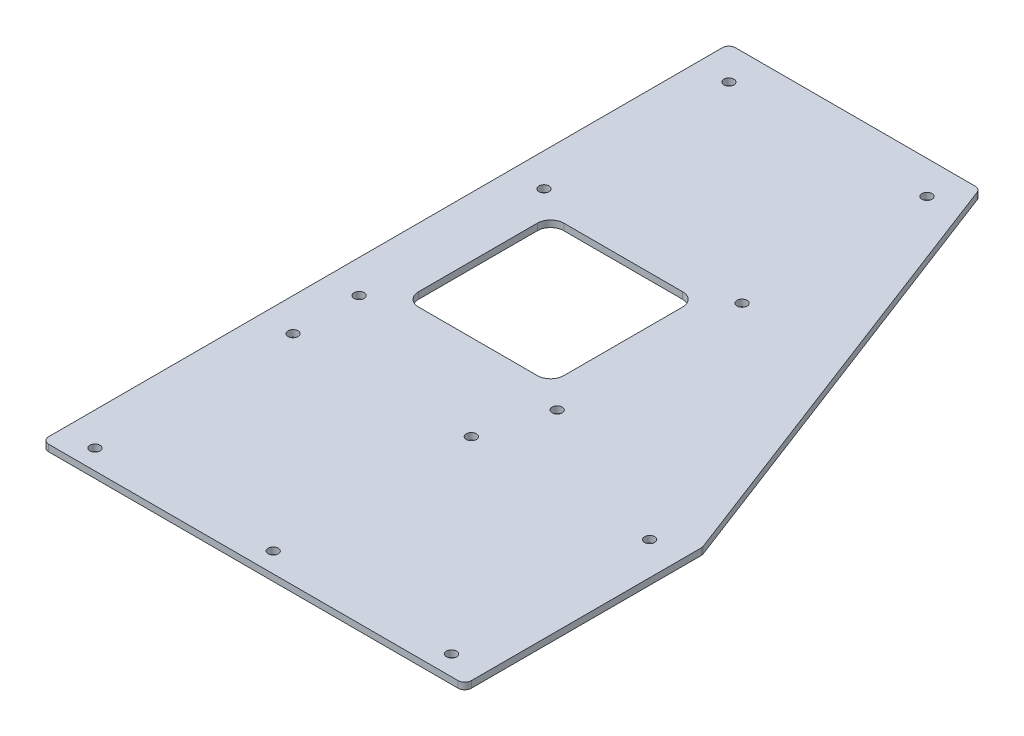
ISO-10303-21;
HEADER;
FILE_DESCRIPTION(('STEP AP214'),'2;1');
FILE_NAME('part.step','',(''),(''),'','','');
FILE_SCHEMA(('AUTOMOTIVE_DESIGN { 1 0 10303 214 1 1 1 1 }'));
ENDSEC;
DATA;
#1=APPLICATION_CONTEXT('core data for automotive mechanical design processes');
#2=APPLICATION_PROTOCOL_DEFINITION('international standard','automotive_design',2000,#1);
#3=PRODUCT_CONTEXT('',#1,'mechanical');
#4=PRODUCT('Part','Part','',(#3));
#5=PRODUCT_RELATED_PRODUCT_CATEGORY('part','',(#4));
#6=PRODUCT_DEFINITION_FORMATION('','',#4);
#7=PRODUCT_DEFINITION_CONTEXT('part definition',#1,'design');
#8=PRODUCT_DEFINITION('design','',#6,#7);
#9=PRODUCT_DEFINITION_SHAPE('','',#8);
#10=(LENGTH_UNIT() NAMED_UNIT(*) SI_UNIT(.MILLI.,.METRE.));
#11=(NAMED_UNIT(*) PLANE_ANGLE_UNIT() SI_UNIT($,.RADIAN.));
#12=(NAMED_UNIT(*) SI_UNIT($,.STERADIAN.) SOLID_ANGLE_UNIT());
#13=UNCERTAINTY_MEASURE_WITH_UNIT(LENGTH_MEASURE(1.E-05),#10,'distance_accuracy_value','');
#14=(GEOMETRIC_REPRESENTATION_CONTEXT(3) GLOBAL_UNCERTAINTY_ASSIGNED_CONTEXT((#13)) GLOBAL_UNIT_ASSIGNED_CONTEXT((#10,
#11,#12)) REPRESENTATION_CONTEXT('',''));
#15=CARTESIAN_POINT('',(0.,0.,0.));
#16=DIRECTION('',(0.,0.,1.));
#17=DIRECTION('',(1.,0.,0.));
#18=AXIS2_PLACEMENT_3D('',#15,#16,#17);
#19=CARTESIAN_POINT('',(0.,3.175,0.));
#20=DIRECTION('',(0.,-1.,0.));
#21=DIRECTION('',(0.,0.,-1.));
#22=AXIS2_PLACEMENT_3D('',#19,#20,#21);
#23=PLANE('',#22);
#24=DIRECTION('',(-1.,0.,0.));
#25=VECTOR('',#24,1.);
#26=CARTESIAN_POINT('',(28.5750000000001,3.175,-215.9));
#27=LINE('',#26,#25);
#28=CARTESIAN_POINT('',(92.0750000000001,3.175,-215.9));
#29=VERTEX_POINT('',#28);
#30=CARTESIAN_POINT('',(34.9250000000001,3.175,-215.9));
#31=VERTEX_POINT('',#30);
#32=EDGE_CURVE('E321',#29,#31,#27,.T.);
#33=ORIENTED_EDGE('',*,*,#32,.F.);
#34=CARTESIAN_POINT('',(92.0750000000001,3.175,-209.55));
#35=DIRECTION('',(0.,-1.,0.));
#36=DIRECTION('',(0.,0.,-1.));
#37=AXIS2_PLACEMENT_3D('',#34,#35,#36);
#38=CIRCLE('',#37,6.35);
#39=CARTESIAN_POINT('',(98.4250000000001,3.175,-209.55));
#40=VERTEX_POINT('',#39);
#41=EDGE_CURVE('E311',#29,#40,#38,.T.);
#42=ORIENTED_EDGE('',*,*,#41,.T.);
#43=DIRECTION('',(0.,0.,-1.));
#44=VECTOR('',#43,1.);
#45=CARTESIAN_POINT('',(98.4250000000001,3.175,-215.9));
#46=LINE('',#45,#44);
#47=CARTESIAN_POINT('',(98.4250000000001,3.175,-152.4));
#48=VERTEX_POINT('',#47);
#49=EDGE_CURVE('E329',#48,#40,#46,.T.);
#50=ORIENTED_EDGE('',*,*,#49,.F.);
#51=CARTESIAN_POINT('',(92.0750000000001,3.175,-152.4));
#52=DIRECTION('',(0.,-1.,0.));
#53=DIRECTION('',(0.,0.,-1.));
#54=AXIS2_PLACEMENT_3D('',#51,#52,#53);
#55=CIRCLE('',#54,6.35);
#56=CARTESIAN_POINT('',(92.0750000000001,3.175,-146.05));
#57=VERTEX_POINT('',#56);
#58=EDGE_CURVE('E299',#48,#57,#55,.T.);
#59=ORIENTED_EDGE('',*,*,#58,.T.);
#60=DIRECTION('',(1.,0.,0.));
#61=VECTOR('',#60,1.);
#62=CARTESIAN_POINT('',(28.5750000000001,3.175,-146.05));
#63=LINE('',#62,#61);
#64=CARTESIAN_POINT('',(34.9250000000001,3.175,-146.05));
#65=VERTEX_POINT('',#64);
#66=EDGE_CURVE('E359',#65,#57,#63,.T.);
#67=ORIENTED_EDGE('',*,*,#66,.F.);
#68=CARTESIAN_POINT('',(34.9250000000001,3.175,-152.4));
#69=DIRECTION('',(0.,-1.,0.));
#70=DIRECTION('',(0.,0.,-1.));
#71=AXIS2_PLACEMENT_3D('',#68,#69,#70);
#72=CIRCLE('',#71,6.35);
#73=CARTESIAN_POINT('',(28.5750000000001,3.175,-152.4));
#74=VERTEX_POINT('',#73);
#75=EDGE_CURVE('E305',#65,#74,#72,.T.);
#76=ORIENTED_EDGE('',*,*,#75,.T.);
#77=DIRECTION('',(0.,0.,1.));
#78=VECTOR('',#77,1.);
#79=CARTESIAN_POINT('',(28.5750000000001,3.175,-215.9));
#80=LINE('',#79,#78);
#81=CARTESIAN_POINT('',(28.5750000000001,3.175,-209.55));
#82=VERTEX_POINT('',#81);
#83=EDGE_CURVE('E323',#82,#74,#80,.T.);
#84=ORIENTED_EDGE('',*,*,#83,.F.);
#85=CARTESIAN_POINT('',(34.9250000000001,3.175,-209.55));
#86=DIRECTION('',(0.,-1.,0.));
#87=DIRECTION('',(0.,0.,-1.));
#88=AXIS2_PLACEMENT_3D('',#85,#86,#87);
#89=CIRCLE('',#88,6.35);
#90=EDGE_CURVE('E45',#82,#31,#89,.T.);
#91=ORIENTED_EDGE('',*,*,#90,.T.);
#92=EDGE_LOOP('',(#33,#42,#50,#59,#67,#76,#84,#91));
#93=FACE_BOUND('',#92,.T.);
#94=DIRECTION('',(-1.,0.,0.));
#95=VECTOR('',#94,1.);
#96=CARTESIAN_POINT('',(0.,3.175,-330.2));
#97=LINE('',#96,#95);
#98=CARTESIAN_POINT('',(118.464801632579,3.175,-330.2));
#99=VERTEX_POINT('',#98);
#100=CARTESIAN_POINT('',(3.175,3.175,-330.2));
#101=VERTEX_POINT('',#100);
#102=EDGE_CURVE('E207',#99,#101,#97,.T.);
#103=ORIENTED_EDGE('',*,*,#102,.T.);
#104=CARTESIAN_POINT('',(3.175,3.175,-327.025));
#105=DIRECTION('',(0.,-1.,0.));
#106=DIRECTION('',(0.,0.,-1.));
#107=AXIS2_PLACEMENT_3D('',#104,#105,#106);
#108=CIRCLE('',#107,3.175);
#109=CARTESIAN_POINT('',(0.,3.175,-327.025));
#110=VERTEX_POINT('',#109);
#111=EDGE_CURVE('E248',#101,#110,#108,.F.);
#112=ORIENTED_EDGE('',*,*,#111,.T.);
#113=DIRECTION('',(0.,0.,1.));
#114=VECTOR('',#113,1.);
#115=CARTESIAN_POINT('',(0.,3.175,0.));
#116=LINE('',#115,#114);
#117=CARTESIAN_POINT('',(0.,3.175,-3.175));
#118=VERTEX_POINT('',#117);
#119=EDGE_CURVE('E184',#110,#118,#116,.T.);
#120=ORIENTED_EDGE('',*,*,#119,.T.);
#121=CARTESIAN_POINT('',(3.175,3.175,-3.175));
#122=DIRECTION('',(0.,-1.,0.));
#123=DIRECTION('',(0.,0.,-1.));
#124=AXIS2_PLACEMENT_3D('',#121,#122,#123);
#125=CIRCLE('',#124,3.175);
#126=CARTESIAN_POINT('',(3.175,3.175,0.));
#127=VERTEX_POINT('',#126);
#128=EDGE_CURVE('E239',#118,#127,#125,.F.);
#129=ORIENTED_EDGE('',*,*,#128,.T.);
#130=DIRECTION('',(1.,0.,0.));
#131=VECTOR('',#130,1.);
#132=CARTESIAN_POINT('',(0.,3.175,0.));
#133=LINE('',#132,#131);
#134=CARTESIAN_POINT('',(200.025,3.175,0.));
#135=VERTEX_POINT('',#134);
#136=EDGE_CURVE('E455',#127,#135,#133,.T.);
#137=ORIENTED_EDGE('',*,*,#136,.T.);
#138=CARTESIAN_POINT('',(200.025,3.175,-3.175));
#139=DIRECTION('',(0.,-1.,0.));
#140=DIRECTION('',(0.,0.,-1.));
#141=AXIS2_PLACEMENT_3D('',#138,#139,#140);
#142=CIRCLE('',#141,3.175);
#143=CARTESIAN_POINT('',(203.2,3.175,-3.175));
#144=VERTEX_POINT('',#143);
#145=EDGE_CURVE('E236',#135,#144,#142,.F.);
#146=ORIENTED_EDGE('',*,*,#145,.T.);
#147=DIRECTION('',(0.,0.,-1.));
#148=VECTOR('',#147,1.);
#149=CARTESIAN_POINT('',(203.2,3.175,0.));
#150=LINE('',#149,#148);
#151=CARTESIAN_POINT('',(203.2,3.175,-113.713711962129));
#152=VERTEX_POINT('',#151);
#153=EDGE_CURVE('E459',#144,#152,#150,.T.);
#154=ORIENTED_EDGE('',*,*,#153,.T.);
#155=CARTESIAN_POINT('',(200.025,3.175,-113.713711962129));
#156=DIRECTION('',(0.,-1.,0.));
#157=DIRECTION('',(0.,0.,-1.));
#158=AXIS2_PLACEMENT_3D('',#155,#156,#157);
#159=CIRCLE('',#158,3.175);
#160=CARTESIAN_POINT('',(202.990614575652,3.175,-114.847623417525));
#161=VERTEX_POINT('',#160);
#162=EDGE_CURVE('E242',#152,#161,#159,.F.);
#163=ORIENTED_EDGE('',*,*,#162,.T.);
#164=DIRECTION('',(-0.357137466266591,0.,-0.934051834851085));
#165=VECTOR('',#164,1.);
#166=CARTESIAN_POINT('',(120.65,3.175,-330.2));
#167=LINE('',#166,#165);
#168=CARTESIAN_POINT('',(121.430416208231,3.175,-328.158911455396));
#169=VERTEX_POINT('',#168);
#170=EDGE_CURVE('E462',#161,#169,#167,.T.);
#171=ORIENTED_EDGE('',*,*,#170,.T.);
#172=CARTESIAN_POINT('',(118.464801632579,3.175,-327.025));
#173=DIRECTION('',(0.,-1.,0.));
#174=DIRECTION('',(0.,0.,-1.));
#175=AXIS2_PLACEMENT_3D('',#172,#173,#174);
#176=CIRCLE('',#175,3.175);
#177=EDGE_CURVE('E245',#169,#99,#176,.F.);
#178=ORIENTED_EDGE('',*,*,#177,.T.);
#179=EDGE_LOOP('',(#103,#112,#120,#129,#137,#146,#154,#163,#171,#178));
#180=FACE_BOUND('',#179,.T.);
#181=CARTESIAN_POINT('',(15.875,3.175,-9.525));
#182=DIRECTION('',(0.,1.,0.));
#183=DIRECTION('',(0.,0.,1.));
#184=AXIS2_PLACEMENT_3D('',#181,#182,#183);
#185=CIRCLE('',#184,2.4257);
#186=CARTESIAN_POINT('',(15.875,3.175,-7.0993));
#187=VERTEX_POINT('',#186);
#188=EDGE_CURVE('E195',#187,#187,#185,.T.);
#189=ORIENTED_EDGE('',*,*,#188,.F.);
#190=EDGE_LOOP('',(#189));
#191=FACE_BOUND('',#190,.T.);
#192=CARTESIAN_POINT('',(101.6,3.175,-9.525));
#193=DIRECTION('',(0.,1.,0.));
#194=DIRECTION('',(0.,0.,1.));
#195=AXIS2_PLACEMENT_3D('',#192,#193,#194);
#196=CIRCLE('',#195,2.4257);
#197=CARTESIAN_POINT('',(101.6,3.175,-7.0993));
#198=VERTEX_POINT('',#197);
#199=EDGE_CURVE('E443',#198,#198,#196,.T.);
#200=ORIENTED_EDGE('',*,*,#199,.F.);
#201=EDGE_LOOP('',(#200));
#202=FACE_BOUND('',#201,.T.);
#203=CARTESIAN_POINT('',(187.325,3.175,-9.525));
#204=DIRECTION('',(0.,1.,0.));
#205=DIRECTION('',(0.,0.,1.));
#206=AXIS2_PLACEMENT_3D('',#203,#204,#205);
#207=CIRCLE('',#206,2.4257);
#208=CARTESIAN_POINT('',(187.325,3.175,-7.0993));
#209=VERTEX_POINT('',#208);
#210=EDGE_CURVE('E435',#209,#209,#207,.T.);
#211=ORIENTED_EDGE('',*,*,#210,.F.);
#212=EDGE_LOOP('',(#211));
#213=FACE_BOUND('',#212,.T.);
#214=CARTESIAN_POINT('',(15.8749999999997,3.175,-104.775));
#215=DIRECTION('',(0.,1.,0.));
#216=DIRECTION('',(0.,0.,1.));
#217=AXIS2_PLACEMENT_3D('',#214,#215,#216);
#218=CIRCLE('',#217,2.4257);
#219=CARTESIAN_POINT('',(15.8749999999997,3.175,-102.3493));
#220=VERTEX_POINT('',#219);
#221=EDGE_CURVE('E427',#220,#220,#218,.T.);
#222=ORIENTED_EDGE('',*,*,#221,.F.);
#223=EDGE_LOOP('',(#222));
#224=FACE_BOUND('',#223,.T.);
#225=CARTESIAN_POINT('',(15.875,3.175,-136.525));
#226=DIRECTION('',(0.,1.,0.));
#227=DIRECTION('',(0.,0.,1.));
#228=AXIS2_PLACEMENT_3D('',#225,#226,#227);
#229=CIRCLE('',#228,2.42570000000001);
#230=CARTESIAN_POINT('',(15.875,3.175,-134.0993));
#231=VERTEX_POINT('',#230);
#232=EDGE_CURVE('E419',#231,#231,#229,.T.);
#233=ORIENTED_EDGE('',*,*,#232,.F.);
#234=EDGE_LOOP('',(#233));
#235=FACE_BOUND('',#234,.T.);
#236=CARTESIAN_POINT('',(187.325,3.175,-104.775));
#237=DIRECTION('',(0.,1.,0.));
#238=DIRECTION('',(0.,0.,1.));
#239=AXIS2_PLACEMENT_3D('',#236,#237,#238);
#240=CIRCLE('',#239,2.4257);
#241=CARTESIAN_POINT('',(187.325,3.175,-102.3493));
#242=VERTEX_POINT('',#241);
#243=EDGE_CURVE('E411',#242,#242,#240,.T.);
#244=ORIENTED_EDGE('',*,*,#243,.F.);
#245=EDGE_LOOP('',(#244));
#246=FACE_BOUND('',#245,.T.);
#247=CARTESIAN_POINT('',(101.6,3.175,-104.775));
#248=DIRECTION('',(0.,1.,0.));
#249=DIRECTION('',(0.,0.,1.));
#250=AXIS2_PLACEMENT_3D('',#247,#248,#249);
#251=CIRCLE('',#250,2.4257);
#252=CARTESIAN_POINT('',(101.6,3.175,-102.3493));
#253=VERTEX_POINT('',#252);
#254=EDGE_CURVE('E403',#253,#253,#251,.T.);
#255=ORIENTED_EDGE('',*,*,#254,.F.);
#256=EDGE_LOOP('',(#255));
#257=FACE_BOUND('',#256,.T.);
#258=CARTESIAN_POINT('',(111.125,3.175,-136.525));
#259=DIRECTION('',(0.,1.,0.));
#260=DIRECTION('',(0.,0.,1.));
#261=AXIS2_PLACEMENT_3D('',#258,#259,#260);
#262=CIRCLE('',#261,2.4257);
#263=CARTESIAN_POINT('',(111.125,3.175,-134.0993));
#264=VERTEX_POINT('',#263);
#265=EDGE_CURVE('E395',#264,#264,#262,.T.);
#266=ORIENTED_EDGE('',*,*,#265,.F.);
#267=EDGE_LOOP('',(#266));
#268=FACE_BOUND('',#267,.T.);
#269=CARTESIAN_POINT('',(15.875,3.175,-225.425));
#270=DIRECTION('',(0.,1.,0.));
#271=DIRECTION('',(0.,0.,1.));
#272=AXIS2_PLACEMENT_3D('',#269,#270,#271);
#273=CIRCLE('',#272,2.42570000000002);
#274=CARTESIAN_POINT('',(15.875,3.175,-222.9993));
#275=VERTEX_POINT('',#274);
#276=EDGE_CURVE('E387',#275,#275,#273,.T.);
#277=ORIENTED_EDGE('',*,*,#276,.F.);
#278=EDGE_LOOP('',(#277));
#279=FACE_BOUND('',#278,.T.);
#280=CARTESIAN_POINT('',(15.875,3.175,-314.325));
#281=DIRECTION('',(0.,1.,0.));
#282=DIRECTION('',(0.,0.,1.));
#283=AXIS2_PLACEMENT_3D('',#280,#281,#282);
#284=CIRCLE('',#283,2.42569999999998);
#285=CARTESIAN_POINT('',(15.875,3.175,-311.8993));
#286=VERTEX_POINT('',#285);
#287=EDGE_CURVE('E379',#286,#286,#284,.T.);
#288=ORIENTED_EDGE('',*,*,#287,.F.);
#289=EDGE_LOOP('',(#288));
#290=FACE_BOUND('',#289,.T.);
#291=CARTESIAN_POINT('',(111.125,3.175,-225.425));
#292=DIRECTION('',(0.,1.,0.));
#293=DIRECTION('',(0.,0.,1.));
#294=AXIS2_PLACEMENT_3D('',#291,#292,#293);
#295=CIRCLE('',#294,2.4257);
#296=CARTESIAN_POINT('',(111.125,3.175,-222.9993));
#297=VERTEX_POINT('',#296);
#298=EDGE_CURVE('E371',#297,#297,#295,.T.);
#299=ORIENTED_EDGE('',*,*,#298,.F.);
#300=EDGE_LOOP('',(#299));
#301=FACE_BOUND('',#300,.T.);
#302=CARTESIAN_POINT('',(111.125,3.175,-314.325));
#303=DIRECTION('',(0.,1.,0.));
#304=DIRECTION('',(0.,0.,1.));
#305=AXIS2_PLACEMENT_3D('',#302,#303,#304);
#306=CIRCLE('',#305,2.42569999999999);
#307=CARTESIAN_POINT('',(111.125,3.175,-311.8993));
#308=VERTEX_POINT('',#307);
#309=EDGE_CURVE('E363',#308,#308,#306,.T.);
#310=ORIENTED_EDGE('',*,*,#309,.F.);
#311=EDGE_LOOP('',(#310));
#312=FACE_BOUND('',#311,.T.);
#313=ADVANCED_FACE('F36',(#93,#180,#191,#202,#213,#224,#235,#246,#257,#268,#279,#290,#301,#312),
#23,.F.);
#314=CARTESIAN_POINT('',(0.,0.,0.));
#315=DIRECTION('',(0.,-1.,0.));
#316=DIRECTION('',(0.,0.,-1.));
#317=AXIS2_PLACEMENT_3D('',#314,#315,#316);
#318=PLANE('',#317);
#319=DIRECTION('',(1.,0.,0.));
#320=VECTOR('',#319,1.);
#321=CARTESIAN_POINT('',(28.5750000000001,0.,-146.05));
#322=LINE('',#321,#320);
#323=CARTESIAN_POINT('',(34.9250000000001,0.,-146.05));
#324=VERTEX_POINT('',#323);
#325=CARTESIAN_POINT('',(92.0750000000001,0.,-146.05));
#326=VERTEX_POINT('',#325);
#327=EDGE_CURVE('E343',#324,#326,#322,.T.);
#328=ORIENTED_EDGE('',*,*,#327,.T.);
#329=CARTESIAN_POINT('',(92.0750000000001,0.,-152.4));
#330=DIRECTION('',(0.,-1.,0.));
#331=DIRECTION('',(0.,0.,-1.));
#332=AXIS2_PLACEMENT_3D('',#329,#330,#331);
#333=CIRCLE('',#332,6.35);
#334=CARTESIAN_POINT('',(98.4250000000001,0.,-152.4));
#335=VERTEX_POINT('',#334);
#336=EDGE_CURVE('E302',#326,#335,#333,.F.);
#337=ORIENTED_EDGE('',*,*,#336,.T.);
#338=DIRECTION('',(0.,0.,-1.));
#339=VECTOR('',#338,1.);
#340=CARTESIAN_POINT('',(98.4250000000001,0.,-215.9));
#341=LINE('',#340,#339);
#342=CARTESIAN_POINT('',(98.4250000000001,0.,-209.55));
#343=VERTEX_POINT('',#342);
#344=EDGE_CURVE('E350',#335,#343,#341,.T.);
#345=ORIENTED_EDGE('',*,*,#344,.T.);
#346=CARTESIAN_POINT('',(92.0750000000001,0.,-209.55));
#347=DIRECTION('',(0.,-1.,0.));
#348=DIRECTION('',(0.,0.,-1.));
#349=AXIS2_PLACEMENT_3D('',#346,#347,#348);
#350=CIRCLE('',#349,6.35);
#351=CARTESIAN_POINT('',(92.0750000000001,0.,-215.9));
#352=VERTEX_POINT('',#351);
#353=EDGE_CURVE('E59',#343,#352,#350,.F.);
#354=ORIENTED_EDGE('',*,*,#353,.T.);
#355=DIRECTION('',(-1.,0.,0.));
#356=VECTOR('',#355,1.);
#357=CARTESIAN_POINT('',(28.5750000000001,0.,-215.9));
#358=LINE('',#357,#356);
#359=CARTESIAN_POINT('',(34.9250000000001,0.,-215.9));
#360=VERTEX_POINT('',#359);
#361=EDGE_CURVE('E338',#352,#360,#358,.T.);
#362=ORIENTED_EDGE('',*,*,#361,.T.);
#363=CARTESIAN_POINT('',(34.9250000000001,0.,-209.55));
#364=DIRECTION('',(0.,-1.,0.));
#365=DIRECTION('',(0.,0.,-1.));
#366=AXIS2_PLACEMENT_3D('',#363,#364,#365);
#367=CIRCLE('',#366,6.35);
#368=CARTESIAN_POINT('',(28.5750000000001,0.,-209.55));
#369=VERTEX_POINT('',#368);
#370=EDGE_CURVE('E11',#360,#369,#367,.F.);
#371=ORIENTED_EDGE('',*,*,#370,.T.);
#372=DIRECTION('',(0.,0.,1.));
#373=VECTOR('',#372,1.);
#374=CARTESIAN_POINT('',(28.5750000000001,0.,-215.9));
#375=LINE('',#374,#373);
#376=CARTESIAN_POINT('',(28.5750000000001,0.,-152.4));
#377=VERTEX_POINT('',#376);
#378=EDGE_CURVE('E336',#369,#377,#375,.T.);
#379=ORIENTED_EDGE('',*,*,#378,.T.);
#380=CARTESIAN_POINT('',(34.9250000000001,0.,-152.4));
#381=DIRECTION('',(0.,-1.,0.));
#382=DIRECTION('',(0.,0.,-1.));
#383=AXIS2_PLACEMENT_3D('',#380,#381,#382);
#384=CIRCLE('',#383,6.35);
#385=EDGE_CURVE('E308',#377,#324,#384,.F.);
#386=ORIENTED_EDGE('',*,*,#385,.T.);
#387=EDGE_LOOP('',(#328,#337,#345,#354,#362,#371,#379,#386));
#388=FACE_BOUND('',#387,.T.);
#389=CARTESIAN_POINT('',(111.125,0.,-225.425));
#390=DIRECTION('',(0.,1.,0.));
#391=DIRECTION('',(0.,0.,1.));
#392=AXIS2_PLACEMENT_3D('',#389,#390,#391);
#393=CIRCLE('',#392,2.4257);
#394=CARTESIAN_POINT('',(111.125,0.,-222.9993));
#395=VERTEX_POINT('',#394);
#396=EDGE_CURVE('E367',#395,#395,#393,.T.);
#397=ORIENTED_EDGE('',*,*,#396,.T.);
#398=EDGE_LOOP('',(#397));
#399=FACE_BOUND('',#398,.T.);
#400=CARTESIAN_POINT('',(15.875,0.,-225.425));
#401=DIRECTION('',(0.,1.,0.));
#402=DIRECTION('',(0.,0.,1.));
#403=AXIS2_PLACEMENT_3D('',#400,#401,#402);
#404=CIRCLE('',#403,2.42570000000002);
#405=CARTESIAN_POINT('',(15.875,0.,-222.9993));
#406=VERTEX_POINT('',#405);
#407=EDGE_CURVE('E383',#406,#406,#404,.T.);
#408=ORIENTED_EDGE('',*,*,#407,.T.);
#409=EDGE_LOOP('',(#408));
#410=FACE_BOUND('',#409,.T.);
#411=CARTESIAN_POINT('',(101.6,0.,-104.775));
#412=DIRECTION('',(0.,1.,0.));
#413=DIRECTION('',(0.,0.,1.));
#414=AXIS2_PLACEMENT_3D('',#411,#412,#413);
#415=CIRCLE('',#414,2.4257);
#416=CARTESIAN_POINT('',(101.6,0.,-102.3493));
#417=VERTEX_POINT('',#416);
#418=EDGE_CURVE('E399',#417,#417,#415,.T.);
#419=ORIENTED_EDGE('',*,*,#418,.T.);
#420=EDGE_LOOP('',(#419));
#421=FACE_BOUND('',#420,.T.);
#422=CARTESIAN_POINT('',(15.875,0.,-136.525));
#423=DIRECTION('',(0.,1.,0.));
#424=DIRECTION('',(0.,0.,1.));
#425=AXIS2_PLACEMENT_3D('',#422,#423,#424);
#426=CIRCLE('',#425,2.42570000000001);
#427=CARTESIAN_POINT('',(15.875,0.,-134.0993));
#428=VERTEX_POINT('',#427);
#429=EDGE_CURVE('E415',#428,#428,#426,.T.);
#430=ORIENTED_EDGE('',*,*,#429,.T.);
#431=EDGE_LOOP('',(#430));
#432=FACE_BOUND('',#431,.T.);
#433=CARTESIAN_POINT('',(187.325,0.,-9.525));
#434=DIRECTION('',(0.,1.,0.));
#435=DIRECTION('',(0.,0.,1.));
#436=AXIS2_PLACEMENT_3D('',#433,#434,#435);
#437=CIRCLE('',#436,2.4257);
#438=CARTESIAN_POINT('',(187.325,0.,-7.0993));
#439=VERTEX_POINT('',#438);
#440=EDGE_CURVE('E431',#439,#439,#437,.T.);
#441=ORIENTED_EDGE('',*,*,#440,.T.);
#442=EDGE_LOOP('',(#441));
#443=FACE_BOUND('',#442,.T.);
#444=CARTESIAN_POINT('',(15.875,0.,-9.525));
#445=DIRECTION('',(0.,1.,0.));
#446=DIRECTION('',(0.,0.,1.));
#447=AXIS2_PLACEMENT_3D('',#444,#445,#446);
#448=CIRCLE('',#447,2.4257);
#449=CARTESIAN_POINT('',(15.875,0.,-7.0993));
#450=VERTEX_POINT('',#449);
#451=EDGE_CURVE('E204',#450,#450,#448,.T.);
#452=ORIENTED_EDGE('',*,*,#451,.T.);
#453=EDGE_LOOP('',(#452));
#454=FACE_BOUND('',#453,.T.);
#455=DIRECTION('',(0.,0.,1.));
#456=VECTOR('',#455,1.);
#457=CARTESIAN_POINT('',(0.,0.,0.));
#458=LINE('',#457,#456);
#459=CARTESIAN_POINT('',(0.,0.,-327.025));
#460=VERTEX_POINT('',#459);
#461=CARTESIAN_POINT('',(0.,0.,-3.175));
#462=VERTEX_POINT('',#461);
#463=EDGE_CURVE('E181',#460,#462,#458,.T.);
#464=ORIENTED_EDGE('',*,*,#463,.F.);
#465=CARTESIAN_POINT('',(3.175,0.,-327.025));
#466=DIRECTION('',(0.,-1.,0.));
#467=DIRECTION('',(0.,0.,-1.));
#468=AXIS2_PLACEMENT_3D('',#465,#466,#467);
#469=CIRCLE('',#468,3.175);
#470=CARTESIAN_POINT('',(3.175,0.,-330.2));
#471=VERTEX_POINT('',#470);
#472=EDGE_CURVE('E163',#460,#471,#469,.T.);
#473=ORIENTED_EDGE('',*,*,#472,.T.);
#474=DIRECTION('',(-1.,0.,0.));
#475=VECTOR('',#474,1.);
#476=CARTESIAN_POINT('',(0.,0.,-330.2));
#477=LINE('',#476,#475);
#478=CARTESIAN_POINT('',(118.464801632579,0.,-330.2));
#479=VERTEX_POINT('',#478);
#480=EDGE_CURVE('E217',#479,#471,#477,.T.);
#481=ORIENTED_EDGE('',*,*,#480,.F.);
#482=CARTESIAN_POINT('',(118.464801632579,0.,-327.025));
#483=DIRECTION('',(0.,-1.,0.));
#484=DIRECTION('',(0.,0.,-1.));
#485=AXIS2_PLACEMENT_3D('',#482,#483,#484);
#486=CIRCLE('',#485,3.175);
#487=CARTESIAN_POINT('',(121.430416208231,0.,-328.158911455396));
#488=VERTEX_POINT('',#487);
#489=EDGE_CURVE('E175',#479,#488,#486,.T.);
#490=ORIENTED_EDGE('',*,*,#489,.T.);
#491=DIRECTION('',(-0.357137466266591,0.,-0.934051834851085));
#492=VECTOR('',#491,1.);
#493=CARTESIAN_POINT('',(120.65,0.,-330.2));
#494=LINE('',#493,#492);
#495=CARTESIAN_POINT('',(202.990614575652,0.,-114.847623417525));
#496=VERTEX_POINT('',#495);
#497=EDGE_CURVE('E213',#496,#488,#494,.T.);
#498=ORIENTED_EDGE('',*,*,#497,.F.);
#499=CARTESIAN_POINT('',(200.025,0.,-113.713711962129));
#500=DIRECTION('',(0.,-1.,0.));
#501=DIRECTION('',(0.,0.,-1.));
#502=AXIS2_PLACEMENT_3D('',#499,#500,#501);
#503=CIRCLE('',#502,3.175);
#504=CARTESIAN_POINT('',(203.2,0.,-113.713711962129));
#505=VERTEX_POINT('',#504);
#506=EDGE_CURVE('E226',#496,#505,#503,.T.);
#507=ORIENTED_EDGE('',*,*,#506,.T.);
#508=DIRECTION('',(0.,0.,-1.));
#509=VECTOR('',#508,1.);
#510=CARTESIAN_POINT('',(203.2,0.,0.));
#511=LINE('',#510,#509);
#512=CARTESIAN_POINT('',(203.2,0.,-3.175));
#513=VERTEX_POINT('',#512);
#514=EDGE_CURVE('E201',#513,#505,#511,.T.);
#515=ORIENTED_EDGE('',*,*,#514,.F.);
#516=CARTESIAN_POINT('',(200.025,0.,-3.175));
#517=DIRECTION('',(0.,-1.,0.));
#518=DIRECTION('',(0.,0.,-1.));
#519=AXIS2_PLACEMENT_3D('',#516,#517,#518);
#520=CIRCLE('',#519,3.175);
#521=CARTESIAN_POINT('',(200.025,0.,0.));
#522=VERTEX_POINT('',#521);
#523=EDGE_CURVE('E186',#513,#522,#520,.T.);
#524=ORIENTED_EDGE('',*,*,#523,.T.);
#525=DIRECTION('',(1.,0.,0.));
#526=VECTOR('',#525,1.);
#527=CARTESIAN_POINT('',(0.,0.,0.));
#528=LINE('',#527,#526);
#529=CARTESIAN_POINT('',(3.175,0.,0.));
#530=VERTEX_POINT('',#529);
#531=EDGE_CURVE('E194',#530,#522,#528,.T.);
#532=ORIENTED_EDGE('',*,*,#531,.F.);
#533=CARTESIAN_POINT('',(3.175,0.,-3.175));
#534=DIRECTION('',(0.,-1.,0.));
#535=DIRECTION('',(0.,0.,-1.));
#536=AXIS2_PLACEMENT_3D('',#533,#534,#535);
#537=CIRCLE('',#536,3.175);
#538=EDGE_CURVE('E192',#530,#462,#537,.T.);
#539=ORIENTED_EDGE('',*,*,#538,.T.);
#540=EDGE_LOOP('',(#464,#473,#481,#490,#498,#507,#515,#524,#532,#539));
#541=FACE_BOUND('',#540,.T.);
#542=CARTESIAN_POINT('',(101.6,0.,-9.525));
#543=DIRECTION('',(0.,1.,0.));
#544=DIRECTION('',(0.,0.,1.));
#545=AXIS2_PLACEMENT_3D('',#542,#543,#544);
#546=CIRCLE('',#545,2.4257);
#547=CARTESIAN_POINT('',(101.6,0.,-7.0993));
#548=VERTEX_POINT('',#547);
#549=EDGE_CURVE('E439',#548,#548,#546,.T.);
#550=ORIENTED_EDGE('',*,*,#549,.T.);
#551=EDGE_LOOP('',(#550));
#552=FACE_BOUND('',#551,.T.);
#553=CARTESIAN_POINT('',(15.8749999999997,0.,-104.775));
#554=DIRECTION('',(0.,1.,0.));
#555=DIRECTION('',(0.,0.,1.));
#556=AXIS2_PLACEMENT_3D('',#553,#554,#555);
#557=CIRCLE('',#556,2.4257);
#558=CARTESIAN_POINT('',(15.8749999999997,0.,-102.3493));
#559=VERTEX_POINT('',#558);
#560=EDGE_CURVE('E423',#559,#559,#557,.T.);
#561=ORIENTED_EDGE('',*,*,#560,.T.);
#562=EDGE_LOOP('',(#561));
#563=FACE_BOUND('',#562,.T.);
#564=CARTESIAN_POINT('',(187.325,0.,-104.775));
#565=DIRECTION('',(0.,1.,0.));
#566=DIRECTION('',(0.,0.,1.));
#567=AXIS2_PLACEMENT_3D('',#564,#565,#566);
#568=CIRCLE('',#567,2.4257);
#569=CARTESIAN_POINT('',(187.325,0.,-102.3493));
#570=VERTEX_POINT('',#569);
#571=EDGE_CURVE('E407',#570,#570,#568,.T.);
#572=ORIENTED_EDGE('',*,*,#571,.T.);
#573=EDGE_LOOP('',(#572));
#574=FACE_BOUND('',#573,.T.);
#575=CARTESIAN_POINT('',(111.125,0.,-136.525));
#576=DIRECTION('',(0.,1.,0.));
#577=DIRECTION('',(0.,0.,1.));
#578=AXIS2_PLACEMENT_3D('',#575,#576,#577);
#579=CIRCLE('',#578,2.4257);
#580=CARTESIAN_POINT('',(111.125,0.,-134.0993));
#581=VERTEX_POINT('',#580);
#582=EDGE_CURVE('E391',#581,#581,#579,.T.);
#583=ORIENTED_EDGE('',*,*,#582,.T.);
#584=EDGE_LOOP('',(#583));
#585=FACE_BOUND('',#584,.T.);
#586=CARTESIAN_POINT('',(15.875,0.,-314.325));
#587=DIRECTION('',(0.,1.,0.));
#588=DIRECTION('',(0.,0.,1.));
#589=AXIS2_PLACEMENT_3D('',#586,#587,#588);
#590=CIRCLE('',#589,2.42569999999998);
#591=CARTESIAN_POINT('',(15.875,0.,-311.8993));
#592=VERTEX_POINT('',#591);
#593=EDGE_CURVE('E375',#592,#592,#590,.T.);
#594=ORIENTED_EDGE('',*,*,#593,.T.);
#595=EDGE_LOOP('',(#594));
#596=FACE_BOUND('',#595,.T.);
#597=CARTESIAN_POINT('',(111.125,0.,-314.325));
#598=DIRECTION('',(0.,1.,0.));
#599=DIRECTION('',(0.,0.,1.));
#600=AXIS2_PLACEMENT_3D('',#597,#598,#599);
#601=CIRCLE('',#600,2.42569999999999);
#602=CARTESIAN_POINT('',(111.125,0.,-311.8993));
#603=VERTEX_POINT('',#602);
#604=EDGE_CURVE('E348',#603,#603,#601,.T.);
#605=ORIENTED_EDGE('',*,*,#604,.T.);
#606=EDGE_LOOP('',(#605));
#607=FACE_BOUND('',#606,.T.);
#608=ADVANCED_FACE('F189',(#388,#399,#410,#421,#432,#443,#454,#541,#552,#563,#574,#585,#596,
#607),#318,.T.);
#609=CARTESIAN_POINT('',(0.,3.175,0.));
#610=DIRECTION('',(1.,0.,0.));
#611=DIRECTION('',(0.,0.,-1.));
#612=AXIS2_PLACEMENT_3D('',#609,#610,#611);
#613=PLANE('',#612);
#614=ORIENTED_EDGE('',*,*,#119,.F.);
#615=DIRECTION('',(0.,-1.,0.));
#616=VECTOR('',#615,1.);
#617=CARTESIAN_POINT('',(0.,3.175,-327.025));
#618=LINE('',#617,#616);
#619=EDGE_CURVE('E167',#110,#460,#618,.T.);
#620=ORIENTED_EDGE('',*,*,#619,.T.);
#621=ORIENTED_EDGE('',*,*,#463,.T.);
#622=DIRECTION('',(0.,-1.,0.));
#623=VECTOR('',#622,1.);
#624=CARTESIAN_POINT('',(0.,3.175,-3.175));
#625=LINE('',#624,#623);
#626=EDGE_CURVE('E187',#462,#118,#625,.F.);
#627=ORIENTED_EDGE('',*,*,#626,.T.);
#628=EDGE_LOOP('',(#614,#620,#621,#627));
#629=FACE_BOUND('',#628,.T.);
#630=ADVANCED_FACE('F180',(#629),#613,.F.);
#631=CARTESIAN_POINT('',(0.,3.175,0.));
#632=DIRECTION('',(0.,0.,-1.));
#633=DIRECTION('',(-1.,0.,0.));
#634=AXIS2_PLACEMENT_3D('',#631,#632,#633);
#635=PLANE('',#634);
#636=ORIENTED_EDGE('',*,*,#136,.F.);
#637=DIRECTION('',(0.,-1.,0.));
#638=VECTOR('',#637,1.);
#639=CARTESIAN_POINT('',(3.175,3.175,0.));
#640=LINE('',#639,#638);
#641=EDGE_CURVE('E268',#127,#530,#640,.T.);
#642=ORIENTED_EDGE('',*,*,#641,.T.);
#643=ORIENTED_EDGE('',*,*,#531,.T.);
#644=DIRECTION('',(0.,-1.,0.));
#645=VECTOR('',#644,1.);
#646=CARTESIAN_POINT('',(200.025,3.175,0.));
#647=LINE('',#646,#645);
#648=EDGE_CURVE('E265',#522,#135,#647,.F.);
#649=ORIENTED_EDGE('',*,*,#648,.T.);
#650=EDGE_LOOP('',(#636,#642,#643,#649));
#651=FACE_BOUND('',#650,.T.);
#652=ADVANCED_FACE('F498',(#651),#635,.F.);
#653=CARTESIAN_POINT('',(203.2,3.175,0.));
#654=DIRECTION('',(-1.,0.,0.));
#655=DIRECTION('',(0.,0.,1.));
#656=AXIS2_PLACEMENT_3D('',#653,#654,#655);
#657=PLANE('',#656);
#658=ORIENTED_EDGE('',*,*,#514,.T.);
#659=DIRECTION('',(0.,-1.,0.));
#660=VECTOR('',#659,1.);
#661=CARTESIAN_POINT('',(203.2,3.175,-113.713711962129));
#662=LINE('',#661,#660);
#663=EDGE_CURVE('E262',#505,#152,#662,.F.);
#664=ORIENTED_EDGE('',*,*,#663,.T.);
#665=ORIENTED_EDGE('',*,*,#153,.F.);
#666=DIRECTION('',(0.,-1.,0.));
#667=VECTOR('',#666,1.);
#668=CARTESIAN_POINT('',(203.2,3.175,-3.175));
#669=LINE('',#668,#667);
#670=EDGE_CURVE('E258',#144,#513,#669,.T.);
#671=ORIENTED_EDGE('',*,*,#670,.T.);
#672=EDGE_LOOP('',(#658,#664,#665,#671));
#673=FACE_BOUND('',#672,.T.);
#674=ADVANCED_FACE('F489',(#673),#657,.F.);
#675=CARTESIAN_POINT('',(120.65,3.175,-330.2));
#676=DIRECTION('',(-0.934051834851085,0.,0.357137466266591));
#677=DIRECTION('',(0.357137466266591,0.,0.934051834851085));
#678=AXIS2_PLACEMENT_3D('',#675,#676,#677);
#679=PLANE('',#678);
#680=ORIENTED_EDGE('',*,*,#497,.T.);
#681=DIRECTION('',(0.,-1.,0.));
#682=VECTOR('',#681,1.);
#683=CARTESIAN_POINT('',(121.430416208231,3.175,-328.158911455396));
#684=LINE('',#683,#682);
#685=EDGE_CURVE('E255',#488,#169,#684,.F.);
#686=ORIENTED_EDGE('',*,*,#685,.T.);
#687=ORIENTED_EDGE('',*,*,#170,.F.);
#688=DIRECTION('',(0.,-1.,0.));
#689=VECTOR('',#688,1.);
#690=CARTESIAN_POINT('',(202.990614575652,3.175,-114.847623417525));
#691=LINE('',#690,#689);
#692=EDGE_CURVE('E251',#161,#496,#691,.T.);
#693=ORIENTED_EDGE('',*,*,#692,.T.);
#694=EDGE_LOOP('',(#680,#686,#687,#693));
#695=FACE_BOUND('',#694,.T.);
#696=ADVANCED_FACE('F481',(#695),#679,.F.);
#697=CARTESIAN_POINT('',(0.,3.175,-330.2));
#698=DIRECTION('',(0.,0.,1.));
#699=DIRECTION('',(1.,0.,0.));
#700=AXIS2_PLACEMENT_3D('',#697,#698,#699);
#701=PLANE('',#700);
#702=ORIENTED_EDGE('',*,*,#480,.T.);
#703=DIRECTION('',(0.,-1.,0.));
#704=VECTOR('',#703,1.);
#705=CARTESIAN_POINT('',(3.175,3.175,-330.2));
#706=LINE('',#705,#704);
#707=EDGE_CURVE('E168',#471,#101,#706,.F.);
#708=ORIENTED_EDGE('',*,*,#707,.T.);
#709=ORIENTED_EDGE('',*,*,#102,.F.);
#710=DIRECTION('',(0.,-1.,0.));
#711=VECTOR('',#710,1.);
#712=CARTESIAN_POINT('',(118.464801632579,3.175,-330.2));
#713=LINE('',#712,#711);
#714=EDGE_CURVE('E174',#99,#479,#713,.T.);
#715=ORIENTED_EDGE('',*,*,#714,.T.);
#716=EDGE_LOOP('',(#702,#708,#709,#715));
#717=FACE_BOUND('',#716,.T.);
#718=ADVANCED_FACE('F475',(#717),#701,.F.);
#719=CARTESIAN_POINT('',(15.875,3.175,-9.525));
#720=DIRECTION('',(0.,-1.,0.));
#721=DIRECTION('',(0.,0.,-1.));
#722=AXIS2_PLACEMENT_3D('',#719,#720,#721);
#723=CYLINDRICAL_SURFACE('',#722,2.4257);
#724=ORIENTED_EDGE('',*,*,#188,.T.);
#725=EDGE_LOOP('',(#724));
#726=FACE_BOUND('',#725,.T.);
#727=ORIENTED_EDGE('',*,*,#451,.F.);
#728=EDGE_LOOP('',(#727));
#729=FACE_BOUND('',#728,.T.);
#730=ADVANCED_FACE('F519',(#726,#729),#723,.F.);
#731=CARTESIAN_POINT('',(101.6,3.175,-9.525));
#732=DIRECTION('',(0.,-1.,0.));
#733=DIRECTION('',(0.,0.,-1.));
#734=AXIS2_PLACEMENT_3D('',#731,#732,#733);
#735=CYLINDRICAL_SURFACE('',#734,2.4257);
#736=ORIENTED_EDGE('',*,*,#199,.T.);
#737=EDGE_LOOP('',(#736));
#738=FACE_BOUND('',#737,.T.);
#739=ORIENTED_EDGE('',*,*,#549,.F.);
#740=EDGE_LOOP('',(#739));
#741=FACE_BOUND('',#740,.T.);
#742=ADVANCED_FACE('F760',(#738,#741),#735,.F.);
#743=CARTESIAN_POINT('',(187.325,3.175,-9.525));
#744=DIRECTION('',(0.,-1.,0.));
#745=DIRECTION('',(0.,0.,-1.));
#746=AXIS2_PLACEMENT_3D('',#743,#744,#745);
#747=CYLINDRICAL_SURFACE('',#746,2.4257);
#748=ORIENTED_EDGE('',*,*,#210,.T.);
#749=EDGE_LOOP('',(#748));
#750=FACE_BOUND('',#749,.T.);
#751=ORIENTED_EDGE('',*,*,#440,.F.);
#752=EDGE_LOOP('',(#751));
#753=FACE_BOUND('',#752,.T.);
#754=ADVANCED_FACE('F750',(#750,#753),#747,.F.);
#755=CARTESIAN_POINT('',(15.8749999999997,3.175,-104.775));
#756=DIRECTION('',(0.,-1.,0.));
#757=DIRECTION('',(0.,0.,-1.));
#758=AXIS2_PLACEMENT_3D('',#755,#756,#757);
#759=CYLINDRICAL_SURFACE('',#758,2.4257);
#760=ORIENTED_EDGE('',*,*,#221,.T.);
#761=EDGE_LOOP('',(#760));
#762=FACE_BOUND('',#761,.T.);
#763=ORIENTED_EDGE('',*,*,#560,.F.);
#764=EDGE_LOOP('',(#763));
#765=FACE_BOUND('',#764,.T.);
#766=ADVANCED_FACE('F740',(#762,#765),#759,.F.);
#767=CARTESIAN_POINT('',(15.875,3.175,-136.525));
#768=DIRECTION('',(0.,-1.,0.));
#769=DIRECTION('',(0.,0.,-1.));
#770=AXIS2_PLACEMENT_3D('',#767,#768,#769);
#771=CYLINDRICAL_SURFACE('',#770,2.42570000000001);
#772=ORIENTED_EDGE('',*,*,#232,.T.);
#773=EDGE_LOOP('',(#772));
#774=FACE_BOUND('',#773,.T.);
#775=ORIENTED_EDGE('',*,*,#429,.F.);
#776=EDGE_LOOP('',(#775));
#777=FACE_BOUND('',#776,.T.);
#778=ADVANCED_FACE('F730',(#774,#777),#771,.F.);
#779=CARTESIAN_POINT('',(187.325,3.175,-104.775));
#780=DIRECTION('',(0.,-1.,0.));
#781=DIRECTION('',(0.,0.,-1.));
#782=AXIS2_PLACEMENT_3D('',#779,#780,#781);
#783=CYLINDRICAL_SURFACE('',#782,2.4257);
#784=ORIENTED_EDGE('',*,*,#243,.T.);
#785=EDGE_LOOP('',(#784));
#786=FACE_BOUND('',#785,.T.);
#787=ORIENTED_EDGE('',*,*,#571,.F.);
#788=EDGE_LOOP('',(#787));
#789=FACE_BOUND('',#788,.T.);
#790=ADVANCED_FACE('F720',(#786,#789),#783,.F.);
#791=CARTESIAN_POINT('',(101.6,3.175,-104.775));
#792=DIRECTION('',(0.,-1.,0.));
#793=DIRECTION('',(0.,0.,-1.));
#794=AXIS2_PLACEMENT_3D('',#791,#792,#793);
#795=CYLINDRICAL_SURFACE('',#794,2.4257);
#796=ORIENTED_EDGE('',*,*,#254,.T.);
#797=EDGE_LOOP('',(#796));
#798=FACE_BOUND('',#797,.T.);
#799=ORIENTED_EDGE('',*,*,#418,.F.);
#800=EDGE_LOOP('',(#799));
#801=FACE_BOUND('',#800,.T.);
#802=ADVANCED_FACE('F710',(#798,#801),#795,.F.);
#803=CARTESIAN_POINT('',(111.125,3.175,-136.525));
#804=DIRECTION('',(0.,-1.,0.));
#805=DIRECTION('',(0.,0.,-1.));
#806=AXIS2_PLACEMENT_3D('',#803,#804,#805);
#807=CYLINDRICAL_SURFACE('',#806,2.4257);
#808=ORIENTED_EDGE('',*,*,#265,.T.);
#809=EDGE_LOOP('',(#808));
#810=FACE_BOUND('',#809,.T.);
#811=ORIENTED_EDGE('',*,*,#582,.F.);
#812=EDGE_LOOP('',(#811));
#813=FACE_BOUND('',#812,.T.);
#814=ADVANCED_FACE('F700',(#810,#813),#807,.F.);
#815=CARTESIAN_POINT('',(15.875,3.175,-225.425));
#816=DIRECTION('',(0.,-1.,0.));
#817=DIRECTION('',(0.,0.,-1.));
#818=AXIS2_PLACEMENT_3D('',#815,#816,#817);
#819=CYLINDRICAL_SURFACE('',#818,2.42570000000002);
#820=ORIENTED_EDGE('',*,*,#276,.T.);
#821=EDGE_LOOP('',(#820));
#822=FACE_BOUND('',#821,.T.);
#823=ORIENTED_EDGE('',*,*,#407,.F.);
#824=EDGE_LOOP('',(#823));
#825=FACE_BOUND('',#824,.T.);
#826=ADVANCED_FACE('F690',(#822,#825),#819,.F.);
#827=CARTESIAN_POINT('',(15.875,3.175,-314.325));
#828=DIRECTION('',(0.,-1.,0.));
#829=DIRECTION('',(0.,0.,-1.));
#830=AXIS2_PLACEMENT_3D('',#827,#828,#829);
#831=CYLINDRICAL_SURFACE('',#830,2.42569999999998);
#832=ORIENTED_EDGE('',*,*,#287,.T.);
#833=EDGE_LOOP('',(#832));
#834=FACE_BOUND('',#833,.T.);
#835=ORIENTED_EDGE('',*,*,#593,.F.);
#836=EDGE_LOOP('',(#835));
#837=FACE_BOUND('',#836,.T.);
#838=ADVANCED_FACE('F680',(#834,#837),#831,.F.);
#839=CARTESIAN_POINT('',(111.125,3.175,-225.425));
#840=DIRECTION('',(0.,-1.,0.));
#841=DIRECTION('',(0.,0.,-1.));
#842=AXIS2_PLACEMENT_3D('',#839,#840,#841);
#843=CYLINDRICAL_SURFACE('',#842,2.4257);
#844=ORIENTED_EDGE('',*,*,#298,.T.);
#845=EDGE_LOOP('',(#844));
#846=FACE_BOUND('',#845,.T.);
#847=ORIENTED_EDGE('',*,*,#396,.F.);
#848=EDGE_LOOP('',(#847));
#849=FACE_BOUND('',#848,.T.);
#850=ADVANCED_FACE('F669',(#846,#849),#843,.F.);
#851=CARTESIAN_POINT('',(111.125,3.175,-314.325));
#852=DIRECTION('',(0.,-1.,0.));
#853=DIRECTION('',(0.,0.,-1.));
#854=AXIS2_PLACEMENT_3D('',#851,#852,#853);
#855=CYLINDRICAL_SURFACE('',#854,2.42569999999999);
#856=ORIENTED_EDGE('',*,*,#309,.T.);
#857=EDGE_LOOP('',(#856));
#858=FACE_BOUND('',#857,.T.);
#859=ORIENTED_EDGE('',*,*,#604,.F.);
#860=EDGE_LOOP('',(#859));
#861=FACE_BOUND('',#860,.T.);
#862=ADVANCED_FACE('F534',(#858,#861),#855,.F.);
#863=CARTESIAN_POINT('',(3.175,3.175,-327.025));
#864=DIRECTION('',(0.,-1.,0.));
#865=DIRECTION('',(0.,0.,-1.));
#866=AXIS2_PLACEMENT_3D('',#863,#864,#865);
#867=CYLINDRICAL_SURFACE('',#866,3.175);
#868=ORIENTED_EDGE('',*,*,#111,.F.);
#869=ORIENTED_EDGE('',*,*,#707,.F.);
#870=ORIENTED_EDGE('',*,*,#472,.F.);
#871=ORIENTED_EDGE('',*,*,#619,.F.);
#872=EDGE_LOOP('',(#868,#869,#870,#871));
#873=FACE_BOUND('',#872,.T.);
#874=ADVANCED_FACE('F166',(#873),#867,.T.);
#875=CARTESIAN_POINT('',(118.464801632579,3.175,-327.025));
#876=DIRECTION('',(0.,-1.,0.));
#877=DIRECTION('',(0.,0.,-1.));
#878=AXIS2_PLACEMENT_3D('',#875,#876,#877);
#879=CYLINDRICAL_SURFACE('',#878,3.175);
#880=ORIENTED_EDGE('',*,*,#177,.F.);
#881=ORIENTED_EDGE('',*,*,#685,.F.);
#882=ORIENTED_EDGE('',*,*,#489,.F.);
#883=ORIENTED_EDGE('',*,*,#714,.F.);
#884=EDGE_LOOP('',(#880,#881,#882,#883));
#885=FACE_BOUND('',#884,.T.);
#886=ADVANCED_FACE('F477',(#885),#879,.T.);
#887=CARTESIAN_POINT('',(200.025,3.175,-113.713711962129));
#888=DIRECTION('',(0.,-1.,0.));
#889=DIRECTION('',(0.,0.,-1.));
#890=AXIS2_PLACEMENT_3D('',#887,#888,#889);
#891=CYLINDRICAL_SURFACE('',#890,3.175);
#892=ORIENTED_EDGE('',*,*,#162,.F.);
#893=ORIENTED_EDGE('',*,*,#663,.F.);
#894=ORIENTED_EDGE('',*,*,#506,.F.);
#895=ORIENTED_EDGE('',*,*,#692,.F.);
#896=EDGE_LOOP('',(#892,#893,#894,#895));
#897=FACE_BOUND('',#896,.T.);
#898=ADVANCED_FACE('F485',(#897),#891,.T.);
#899=CARTESIAN_POINT('',(3.175,3.175,-3.175));
#900=DIRECTION('',(0.,-1.,0.));
#901=DIRECTION('',(0.,0.,-1.));
#902=AXIS2_PLACEMENT_3D('',#899,#900,#901);
#903=CYLINDRICAL_SURFACE('',#902,3.175);
#904=ORIENTED_EDGE('',*,*,#128,.F.);
#905=ORIENTED_EDGE('',*,*,#626,.F.);
#906=ORIENTED_EDGE('',*,*,#538,.F.);
#907=ORIENTED_EDGE('',*,*,#641,.F.);
#908=EDGE_LOOP('',(#904,#905,#906,#907));
#909=FACE_BOUND('',#908,.T.);
#910=ADVANCED_FACE('F502',(#909),#903,.T.);
#911=CARTESIAN_POINT('',(200.025,3.175,-3.175));
#912=DIRECTION('',(0.,-1.,0.));
#913=DIRECTION('',(0.,0.,-1.));
#914=AXIS2_PLACEMENT_3D('',#911,#912,#913);
#915=CYLINDRICAL_SURFACE('',#914,3.175);
#916=ORIENTED_EDGE('',*,*,#145,.F.);
#917=ORIENTED_EDGE('',*,*,#648,.F.);
#918=ORIENTED_EDGE('',*,*,#523,.F.);
#919=ORIENTED_EDGE('',*,*,#670,.F.);
#920=EDGE_LOOP('',(#916,#917,#918,#919));
#921=FACE_BOUND('',#920,.T.);
#922=ADVANCED_FACE('F494',(#921),#915,.T.);
#923=CARTESIAN_POINT('',(98.4250000000001,0.,-215.9));
#924=DIRECTION('',(1.,0.,0.));
#925=DIRECTION('',(0.,0.,-1.));
#926=AXIS2_PLACEMENT_3D('',#923,#924,#925);
#927=PLANE('',#926);
#928=ORIENTED_EDGE('',*,*,#344,.F.);
#929=DIRECTION('',(0.,1.,0.));
#930=VECTOR('',#929,1.);
#931=CARTESIAN_POINT('',(98.4250000000001,3.175,-152.4));
#932=LINE('',#931,#930);
#933=EDGE_CURVE('E275',#335,#48,#932,.T.);
#934=ORIENTED_EDGE('',*,*,#933,.T.);
#935=ORIENTED_EDGE('',*,*,#49,.T.);
#936=DIRECTION('',(0.,1.,0.));
#937=VECTOR('',#936,1.);
#938=CARTESIAN_POINT('',(98.4250000000001,0.,-209.55));
#939=LINE('',#938,#937);
#940=EDGE_CURVE('E272',#40,#343,#939,.F.);
#941=ORIENTED_EDGE('',*,*,#940,.T.);
#942=EDGE_LOOP('',(#928,#934,#935,#941));
#943=FACE_BOUND('',#942,.T.);
#944=ADVANCED_FACE('F509',(#943),#927,.F.);
#945=CARTESIAN_POINT('',(28.5750000000001,0.,-146.05));
#946=DIRECTION('',(0.,0.,1.));
#947=DIRECTION('',(1.,0.,0.));
#948=AXIS2_PLACEMENT_3D('',#945,#946,#947);
#949=PLANE('',#948);
#950=ORIENTED_EDGE('',*,*,#66,.T.);
#951=DIRECTION('',(0.,1.,0.));
#952=VECTOR('',#951,1.);
#953=CARTESIAN_POINT('',(92.0750000000001,0.,-146.05));
#954=LINE('',#953,#952);
#955=EDGE_CURVE('E283',#57,#326,#954,.F.);
#956=ORIENTED_EDGE('',*,*,#955,.T.);
#957=ORIENTED_EDGE('',*,*,#327,.F.);
#958=DIRECTION('',(0.,1.,0.));
#959=VECTOR('',#958,1.);
#960=CARTESIAN_POINT('',(34.9250000000001,3.175,-146.05));
#961=LINE('',#960,#959);
#962=EDGE_CURVE('E279',#324,#65,#961,.T.);
#963=ORIENTED_EDGE('',*,*,#962,.T.);
#964=EDGE_LOOP('',(#950,#956,#957,#963));
#965=FACE_BOUND('',#964,.T.);
#966=ADVANCED_FACE('F565',(#965),#949,.F.);
#967=CARTESIAN_POINT('',(28.5750000000001,0.,-215.9));
#968=DIRECTION('',(-1.,0.,0.));
#969=DIRECTION('',(0.,0.,1.));
#970=AXIS2_PLACEMENT_3D('',#967,#968,#969);
#971=PLANE('',#970);
#972=ORIENTED_EDGE('',*,*,#83,.T.);
#973=DIRECTION('',(0.,1.,0.));
#974=VECTOR('',#973,1.);
#975=CARTESIAN_POINT('',(28.5750000000001,0.,-152.4));
#976=LINE('',#975,#974);
#977=EDGE_CURVE('E290',#74,#377,#976,.F.);
#978=ORIENTED_EDGE('',*,*,#977,.T.);
#979=ORIENTED_EDGE('',*,*,#378,.F.);
#980=DIRECTION('',(0.,1.,0.));
#981=VECTOR('',#980,1.);
#982=CARTESIAN_POINT('',(28.5750000000001,3.175,-209.55));
#983=LINE('',#982,#981);
#984=EDGE_CURVE('E286',#369,#82,#983,.T.);
#985=ORIENTED_EDGE('',*,*,#984,.T.);
#986=EDGE_LOOP('',(#972,#978,#979,#985));
#987=FACE_BOUND('',#986,.T.);
#988=ADVANCED_FACE('F340',(#987),#971,.F.);
#989=CARTESIAN_POINT('',(28.5750000000001,0.,-215.9));
#990=DIRECTION('',(0.,0.,-1.));
#991=DIRECTION('',(-1.,0.,0.));
#992=AXIS2_PLACEMENT_3D('',#989,#990,#991);
#993=PLANE('',#992);
#994=ORIENTED_EDGE('',*,*,#361,.F.);
#995=DIRECTION('',(0.,1.,0.));
#996=VECTOR('',#995,1.);
#997=CARTESIAN_POINT('',(92.0750000000001,3.175,-215.9));
#998=LINE('',#997,#996);
#999=EDGE_CURVE('E295',#352,#29,#998,.T.);
#1000=ORIENTED_EDGE('',*,*,#999,.T.);
#1001=ORIENTED_EDGE('',*,*,#32,.T.);
#1002=DIRECTION('',(0.,1.,0.));
#1003=VECTOR('',#1002,1.);
#1004=CARTESIAN_POINT('',(34.9250000000001,0.,-215.9));
#1005=LINE('',#1004,#1003);
#1006=EDGE_CURVE('E52',#31,#360,#1005,.F.);
#1007=ORIENTED_EDGE('',*,*,#1006,.T.);
#1008=EDGE_LOOP('',(#994,#1000,#1001,#1007));
#1009=FACE_BOUND('',#1008,.T.);
#1010=ADVANCED_FACE('F326',(#1009),#993,.F.);
#1011=CARTESIAN_POINT('',(92.0750000000001,0.,-152.4));
#1012=DIRECTION('',(0.,-1.,0.));
#1013=DIRECTION('',(0.,0.,-1.));
#1014=AXIS2_PLACEMENT_3D('',#1011,#1012,#1013);
#1015=CYLINDRICAL_SURFACE('',#1014,6.35);
#1016=ORIENTED_EDGE('',*,*,#336,.F.);
#1017=ORIENTED_EDGE('',*,*,#955,.F.);
#1018=ORIENTED_EDGE('',*,*,#58,.F.);
#1019=ORIENTED_EDGE('',*,*,#933,.F.);
#1020=EDGE_LOOP('',(#1016,#1017,#1018,#1019));
#1021=FACE_BOUND('',#1020,.T.);
#1022=ADVANCED_FACE('F593',(#1021),#1015,.F.);
#1023=CARTESIAN_POINT('',(34.9250000000001,0.,-152.4));
#1024=DIRECTION('',(0.,-1.,0.));
#1025=DIRECTION('',(0.,0.,-1.));
#1026=AXIS2_PLACEMENT_3D('',#1023,#1024,#1025);
#1027=CYLINDRICAL_SURFACE('',#1026,6.35);
#1028=ORIENTED_EDGE('',*,*,#385,.F.);
#1029=ORIENTED_EDGE('',*,*,#977,.F.);
#1030=ORIENTED_EDGE('',*,*,#75,.F.);
#1031=ORIENTED_EDGE('',*,*,#962,.F.);
#1032=EDGE_LOOP('',(#1028,#1029,#1030,#1031));
#1033=FACE_BOUND('',#1032,.T.);
#1034=ADVANCED_FACE('F602',(#1033),#1027,.F.);
#1035=CARTESIAN_POINT('',(92.0750000000001,0.,-209.55));
#1036=DIRECTION('',(0.,-1.,0.));
#1037=DIRECTION('',(0.,0.,-1.));
#1038=AXIS2_PLACEMENT_3D('',#1035,#1036,#1037);
#1039=CYLINDRICAL_SURFACE('',#1038,6.35);
#1040=ORIENTED_EDGE('',*,*,#353,.F.);
#1041=ORIENTED_EDGE('',*,*,#940,.F.);
#1042=ORIENTED_EDGE('',*,*,#41,.F.);
#1043=ORIENTED_EDGE('',*,*,#999,.F.);
#1044=EDGE_LOOP('',(#1040,#1041,#1042,#1043));
#1045=FACE_BOUND('',#1044,.T.);
#1046=ADVANCED_FACE('F612',(#1045),#1039,.F.);
#1047=CARTESIAN_POINT('',(34.9250000000001,0.,-209.55));
#1048=DIRECTION('',(0.,-1.,0.));
#1049=DIRECTION('',(0.,0.,-1.));
#1050=AXIS2_PLACEMENT_3D('',#1047,#1048,#1049);
#1051=CYLINDRICAL_SURFACE('',#1050,6.35);
#1052=ORIENTED_EDGE('',*,*,#370,.F.);
#1053=ORIENTED_EDGE('',*,*,#1006,.F.);
#1054=ORIENTED_EDGE('',*,*,#90,.F.);
#1055=ORIENTED_EDGE('',*,*,#984,.F.);
#1056=EDGE_LOOP('',(#1052,#1053,#1054,#1055));
#1057=FACE_BOUND('',#1056,.T.);
#1058=ADVANCED_FACE('F38',(#1057),#1051,.F.);
#1059=CLOSED_SHELL('',(#313,#608,#630,#652,#674,#696,#718,#730,#742,#754,#766,#778,#790,#802,
#814,#826,#838,#850,#862,#874,#886,#898,#910,#922,#944,#966,#988,#1010,#1022,#1034,#1046,#1058));
#1060=MANIFOLD_SOLID_BREP('B2',#1059);
#1061=ADVANCED_BREP_SHAPE_REPRESENTATION('',(#18,#1060),#14);
#1062=SHAPE_DEFINITION_REPRESENTATION(#9,#1061);
ENDSEC;
END-ISO-10303-21;
